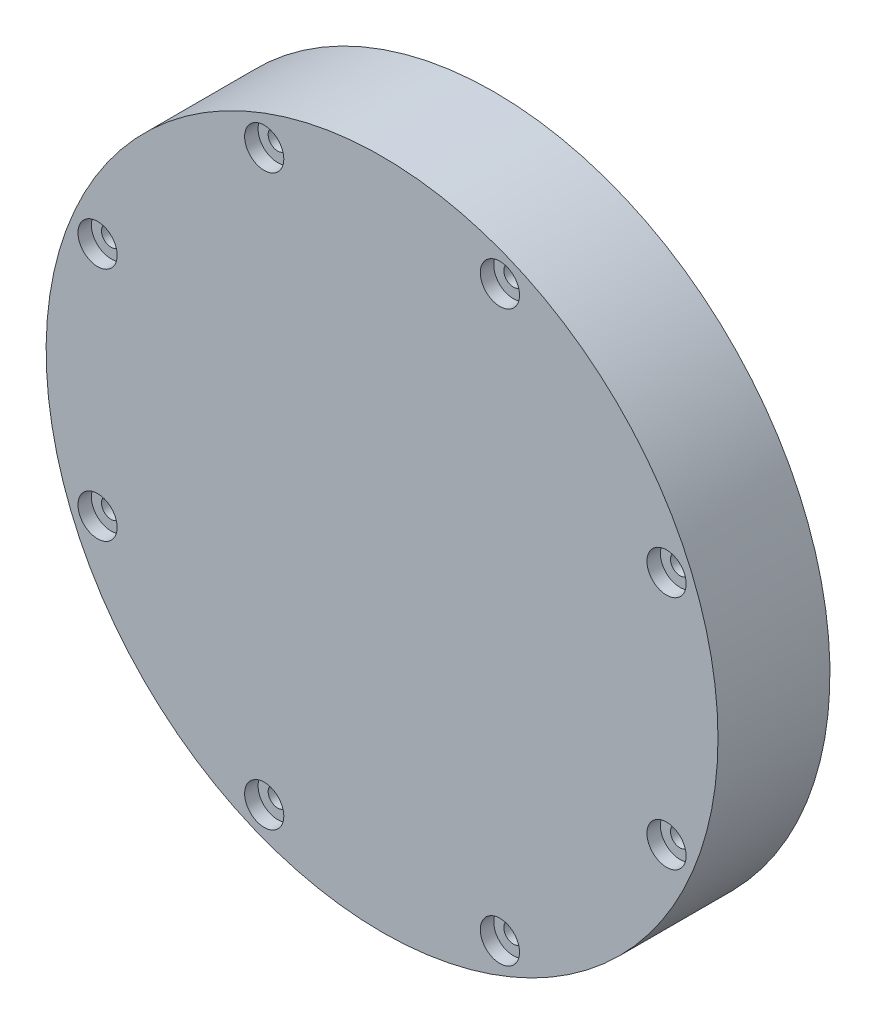
ISO-10303-21;
HEADER;
FILE_DESCRIPTION(('STEP AP214'),'2;1');
FILE_NAME('part.step','',(''),(''),'','','');
FILE_SCHEMA(('AUTOMOTIVE_DESIGN { 1 0 10303 214 1 1 1 1 }'));
ENDSEC;
DATA;
#1=APPLICATION_CONTEXT('core data for automotive mechanical design processes');
#2=APPLICATION_PROTOCOL_DEFINITION('international standard','automotive_design',2000,#1);
#3=PRODUCT_CONTEXT('',#1,'mechanical');
#4=PRODUCT('Part','Part','',(#3));
#5=PRODUCT_RELATED_PRODUCT_CATEGORY('part','',(#4));
#6=PRODUCT_DEFINITION_FORMATION('','',#4);
#7=PRODUCT_DEFINITION_CONTEXT('part definition',#1,'design');
#8=PRODUCT_DEFINITION('design','',#6,#7);
#9=PRODUCT_DEFINITION_SHAPE('','',#8);
#10=(LENGTH_UNIT() NAMED_UNIT(*) SI_UNIT(.MILLI.,.METRE.));
#11=(NAMED_UNIT(*) PLANE_ANGLE_UNIT() SI_UNIT($,.RADIAN.));
#12=(NAMED_UNIT(*) SI_UNIT($,.STERADIAN.) SOLID_ANGLE_UNIT());
#13=UNCERTAINTY_MEASURE_WITH_UNIT(LENGTH_MEASURE(1.E-05),#10,'distance_accuracy_value','');
#14=(GEOMETRIC_REPRESENTATION_CONTEXT(3) GLOBAL_UNCERTAINTY_ASSIGNED_CONTEXT((#13)) GLOBAL_UNIT_ASSIGNED_CONTEXT((#10,
#11,#12)) REPRESENTATION_CONTEXT('',''));
#15=CARTESIAN_POINT('',(0.,0.,0.));
#16=DIRECTION('',(0.,0.,1.));
#17=DIRECTION('',(1.,0.,0.));
#18=AXIS2_PLACEMENT_3D('',#15,#16,#17);
#19=CARTESIAN_POINT('',(18.,-54.0832691319598,15.));
#20=DIRECTION('',(0.,0.,-1.));
#21=DIRECTION('',(-1.,0.,0.));
#22=AXIS2_PLACEMENT_3D('',#19,#20,#21);
#23=CYLINDRICAL_SURFACE('',#22,3.);
#24=CARTESIAN_POINT('',(18.,-54.0832691319598,0.));
#25=DIRECTION('',(0.,0.,1.));
#26=DIRECTION('',(1.,0.,0.));
#27=AXIS2_PLACEMENT_3D('',#24,#25,#26);
#28=CIRCLE('',#27,3.);
#29=CARTESIAN_POINT('',(15.,-54.0832691319598,0.));
#30=VERTEX_POINT('',#29);
#31=CARTESIAN_POINT('',(18.9473684210526,-56.9297569810104,0.));
#32=VERTEX_POINT('',#31);
#33=EDGE_CURVE('E139',#30,#32,#28,.T.);
#34=ORIENTED_EDGE('',*,*,#33,.T.);
#35=DIRECTION('',(0.,0.,-1.));
#36=VECTOR('',#35,1.);
#37=CARTESIAN_POINT('',(18.9473684210526,-56.9297569810104,15.));
#38=LINE('',#37,#36);
#39=CARTESIAN_POINT('',(18.9473684210526,-56.9297569810104,15.));
#40=VERTEX_POINT('',#39);
#41=EDGE_CURVE('E11',#40,#32,#38,.T.);
#42=ORIENTED_EDGE('',*,*,#41,.F.);
#43=CARTESIAN_POINT('',(18.,-54.0832691319598,15.));
#44=DIRECTION('',(0.,0.,1.));
#45=DIRECTION('',(1.,0.,0.));
#46=AXIS2_PLACEMENT_3D('',#43,#44,#45);
#47=CIRCLE('',#46,3.);
#48=CARTESIAN_POINT('',(15.,-54.0832691319598,15.));
#49=VERTEX_POINT('',#48);
#50=EDGE_CURVE('E153',#49,#40,#47,.T.);
#51=ORIENTED_EDGE('',*,*,#50,.F.);
#52=DIRECTION('',(0.,0.,-1.));
#53=VECTOR('',#52,1.);
#54=CARTESIAN_POINT('',(15.,-54.0832691319598,15.));
#55=LINE('',#54,#53);
#56=EDGE_CURVE('E138',#49,#30,#55,.T.);
#57=ORIENTED_EDGE('',*,*,#56,.T.);
#58=EDGE_LOOP('',(#34,#42,#51,#57));
#59=FACE_BOUND('',#58,.T.);
#60=ADVANCED_FACE('F32',(#59),#23,.T.);
#61=CARTESIAN_POINT('',(0.,0.,15.));
#62=DIRECTION('',(0.,0.,-1.));
#63=DIRECTION('',(-1.,0.,0.));
#64=AXIS2_PLACEMENT_3D('',#61,#62,#63);
#65=CYLINDRICAL_SURFACE('',#64,60.);
#66=CARTESIAN_POINT('',(0.,0.,0.));
#67=DIRECTION('',(0.,0.,1.));
#68=DIRECTION('',(1.,0.,0.));
#69=AXIS2_PLACEMENT_3D('',#66,#67,#68);
#70=CIRCLE('',#69,60.);
#71=CARTESIAN_POINT('',(-18.9473684210526,-56.9297569810103,0.));
#72=VERTEX_POINT('',#71);
#73=EDGE_CURVE('E141',#32,#72,#70,.T.);
#74=ORIENTED_EDGE('',*,*,#73,.T.);
#75=DIRECTION('',(0.,0.,-1.));
#76=VECTOR('',#75,1.);
#77=CARTESIAN_POINT('',(-18.9473684210526,-56.9297569810103,15.));
#78=LINE('',#77,#76);
#79=CARTESIAN_POINT('',(-18.9473684210526,-56.9297569810103,15.));
#80=VERTEX_POINT('',#79);
#81=EDGE_CURVE('E40',#80,#72,#78,.T.);
#82=ORIENTED_EDGE('',*,*,#81,.F.);
#83=CARTESIAN_POINT('',(0.,0.,15.));
#84=DIRECTION('',(0.,0.,1.));
#85=DIRECTION('',(1.,0.,0.));
#86=AXIS2_PLACEMENT_3D('',#83,#84,#85);
#87=CIRCLE('',#86,60.);
#88=EDGE_CURVE('E174',#80,#40,#87,.T.);
#89=ORIENTED_EDGE('',*,*,#88,.T.);
#90=ORIENTED_EDGE('',*,*,#41,.T.);
#91=EDGE_LOOP('',(#74,#82,#89,#90));
#92=FACE_BOUND('',#91,.T.);
#93=CARTESIAN_POINT('',(0.,0.,20.));
#94=DIRECTION('',(0.,0.,1.));
#95=DIRECTION('',(1.,0.,0.));
#96=AXIS2_PLACEMENT_3D('',#93,#94,#95);
#97=CIRCLE('',#96,60.);
#98=CARTESIAN_POINT('',(60.,0.,20.));
#99=VERTEX_POINT('',#98);
#100=EDGE_CURVE('E142',#99,#99,#97,.T.);
#101=ORIENTED_EDGE('',*,*,#100,.F.);
#102=EDGE_LOOP('',(#101));
#103=FACE_BOUND('',#102,.T.);
#104=ADVANCED_FACE('F300',(#92,#103),#65,.T.);
#105=CARTESIAN_POINT('',(-18.,-54.0832691319598,15.));
#106=DIRECTION('',(0.,0.,-1.));
#107=DIRECTION('',(-1.,0.,0.));
#108=AXIS2_PLACEMENT_3D('',#105,#106,#107);
#109=CYLINDRICAL_SURFACE('',#108,3.);
#110=CARTESIAN_POINT('',(-18.,-54.0832691319598,0.));
#111=DIRECTION('',(0.,0.,1.));
#112=DIRECTION('',(-1.,0.,0.));
#113=AXIS2_PLACEMENT_3D('',#110,#111,#112);
#114=CIRCLE('',#113,3.);
#115=CARTESIAN_POINT('',(-15.,-54.0832691319598,0.));
#116=VERTEX_POINT('',#115);
#117=EDGE_CURVE('E144',#72,#116,#114,.T.);
#118=ORIENTED_EDGE('',*,*,#117,.T.);
#119=DIRECTION('',(0.,0.,-1.));
#120=VECTOR('',#119,1.);
#121=CARTESIAN_POINT('',(-15.,-54.0832691319598,15.));
#122=LINE('',#121,#120);
#123=CARTESIAN_POINT('',(-15.,-54.0832691319598,15.));
#124=VERTEX_POINT('',#123);
#125=EDGE_CURVE('E158',#124,#116,#122,.T.);
#126=ORIENTED_EDGE('',*,*,#125,.F.);
#127=CARTESIAN_POINT('',(-18.,-54.0832691319598,15.));
#128=DIRECTION('',(0.,0.,1.));
#129=DIRECTION('',(-1.,0.,0.));
#130=AXIS2_PLACEMENT_3D('',#127,#128,#129);
#131=CIRCLE('',#130,3.);
#132=EDGE_CURVE('E131',#80,#124,#131,.T.);
#133=ORIENTED_EDGE('',*,*,#132,.F.);
#134=ORIENTED_EDGE('',*,*,#81,.T.);
#135=EDGE_LOOP('',(#118,#126,#133,#134));
#136=FACE_BOUND('',#135,.T.);
#137=ADVANCED_FACE('F164',(#136),#109,.T.);
#138=CARTESIAN_POINT('',(-15.,-49.8497743224581,15.));
#139=DIRECTION('',(-1.,0.,0.));
#140=DIRECTION('',(0.,0.,1.));
#141=AXIS2_PLACEMENT_3D('',#138,#139,#140);
#142=PLANE('',#141);
#143=DIRECTION('',(0.,1.,0.));
#144=VECTOR('',#143,1.);
#145=CARTESIAN_POINT('',(-15.,-49.8497743224581,0.));
#146=LINE('',#145,#144);
#147=CARTESIAN_POINT('',(-15.,-49.8497743224581,0.));
#148=VERTEX_POINT('',#147);
#149=EDGE_CURVE('E146',#116,#148,#146,.T.);
#150=ORIENTED_EDGE('',*,*,#149,.T.);
#151=DIRECTION('',(0.,0.,-1.));
#152=VECTOR('',#151,1.);
#153=CARTESIAN_POINT('',(-15.,-49.8497743224581,15.));
#154=LINE('',#153,#152);
#155=CARTESIAN_POINT('',(-15.,-49.8497743224581,15.));
#156=VERTEX_POINT('',#155);
#157=EDGE_CURVE('E115',#156,#148,#154,.T.);
#158=ORIENTED_EDGE('',*,*,#157,.F.);
#159=DIRECTION('',(0.,1.,0.));
#160=VECTOR('',#159,1.);
#161=CARTESIAN_POINT('',(-15.,-49.8497743224581,15.));
#162=LINE('',#161,#160);
#163=EDGE_CURVE('E129',#124,#156,#162,.T.);
#164=ORIENTED_EDGE('',*,*,#163,.F.);
#165=ORIENTED_EDGE('',*,*,#125,.T.);
#166=EDGE_LOOP('',(#150,#158,#164,#165));
#167=FACE_BOUND('',#166,.T.);
#168=ADVANCED_FACE('F173',(#167),#142,.F.);
#169=CARTESIAN_POINT('',(-18.,-49.8497743224581,15.));
#170=DIRECTION('',(0.,0.,-1.));
#171=DIRECTION('',(-1.,0.,0.));
#172=AXIS2_PLACEMENT_3D('',#169,#170,#171);
#173=CYLINDRICAL_SURFACE('',#172,3.);
#174=CARTESIAN_POINT('',(-18.,-49.8497743224581,0.));
#175=DIRECTION('',(0.,0.,1.));
#176=DIRECTION('',(1.,0.,0.));
#177=AXIS2_PLACEMENT_3D('',#174,#175,#176);
#178=CIRCLE('',#177,3.);
#179=CARTESIAN_POINT('',(-16.9811320754718,-47.028088983451,0.));
#180=VERTEX_POINT('',#179);
#181=EDGE_CURVE('E112',#148,#180,#178,.T.);
#182=ORIENTED_EDGE('',*,*,#181,.T.);
#183=DIRECTION('',(0.,0.,-1.));
#184=VECTOR('',#183,1.);
#185=CARTESIAN_POINT('',(-16.9811320754718,-47.028088983451,15.));
#186=LINE('',#185,#184);
#187=CARTESIAN_POINT('',(-16.9811320754718,-47.028088983451,15.));
#188=VERTEX_POINT('',#187);
#189=EDGE_CURVE('E104',#188,#180,#186,.T.);
#190=ORIENTED_EDGE('',*,*,#189,.F.);
#191=CARTESIAN_POINT('',(-18.,-49.8497743224581,15.));
#192=DIRECTION('',(0.,0.,1.));
#193=DIRECTION('',(1.,0.,0.));
#194=AXIS2_PLACEMENT_3D('',#191,#192,#193);
#195=CIRCLE('',#194,3.);
#196=EDGE_CURVE('E109',#156,#188,#195,.T.);
#197=ORIENTED_EDGE('',*,*,#196,.F.);
#198=ORIENTED_EDGE('',*,*,#157,.T.);
#199=EDGE_LOOP('',(#182,#190,#197,#198));
#200=FACE_BOUND('',#199,.T.);
#201=ADVANCED_FACE('F106',(#200),#173,.T.);
#202=CARTESIAN_POINT('',(0.,0.,15.));
#203=DIRECTION('',(0.,0.,-1.));
#204=DIRECTION('',(-1.,0.,0.));
#205=AXIS2_PLACEMENT_3D('',#202,#203,#204);
#206=CYLINDRICAL_SURFACE('',#205,50.);
#207=CARTESIAN_POINT('',(0.,0.,0.));
#208=DIRECTION('',(0.,0.,-1.));
#209=DIRECTION('',(1.,0.,0.));
#210=AXIS2_PLACEMENT_3D('',#207,#208,#209);
#211=CIRCLE('',#210,50.);
#212=CARTESIAN_POINT('',(16.9811320754717,-47.028088983451,0.));
#213=VERTEX_POINT('',#212);
#214=EDGE_CURVE('E149',#180,#213,#211,.T.);
#215=ORIENTED_EDGE('',*,*,#214,.T.);
#216=DIRECTION('',(0.,0.,-1.));
#217=VECTOR('',#216,1.);
#218=CARTESIAN_POINT('',(16.9811320754717,-47.028088983451,15.));
#219=LINE('',#218,#217);
#220=CARTESIAN_POINT('',(16.9811320754717,-47.028088983451,15.));
#221=VERTEX_POINT('',#220);
#222=EDGE_CURVE('E116',#221,#213,#219,.T.);
#223=ORIENTED_EDGE('',*,*,#222,.F.);
#224=CARTESIAN_POINT('',(0.,0.,15.));
#225=DIRECTION('',(0.,0.,-1.));
#226=DIRECTION('',(1.,0.,0.));
#227=AXIS2_PLACEMENT_3D('',#224,#225,#226);
#228=CIRCLE('',#227,50.);
#229=EDGE_CURVE('E119',#188,#221,#228,.T.);
#230=ORIENTED_EDGE('',*,*,#229,.F.);
#231=ORIENTED_EDGE('',*,*,#189,.T.);
#232=EDGE_LOOP('',(#215,#223,#230,#231));
#233=FACE_BOUND('',#232,.T.);
#234=ADVANCED_FACE('F120',(#233),#206,.F.);
#235=CARTESIAN_POINT('',(18.,-49.8497743224581,15.));
#236=DIRECTION('',(0.,0.,-1.));
#237=DIRECTION('',(-1.,0.,0.));
#238=AXIS2_PLACEMENT_3D('',#235,#236,#237);
#239=CYLINDRICAL_SURFACE('',#238,3.);
#240=CARTESIAN_POINT('',(18.,-49.8497743224581,0.));
#241=DIRECTION('',(0.,0.,1.));
#242=DIRECTION('',(-1.,0.,0.));
#243=AXIS2_PLACEMENT_3D('',#240,#241,#242);
#244=CIRCLE('',#243,3.);
#245=CARTESIAN_POINT('',(15.,-49.8497743224581,0.));
#246=VERTEX_POINT('',#245);
#247=EDGE_CURVE('E76',#213,#246,#244,.T.);
#248=ORIENTED_EDGE('',*,*,#247,.T.);
#249=DIRECTION('',(0.,0.,-1.));
#250=VECTOR('',#249,1.);
#251=CARTESIAN_POINT('',(15.,-49.8497743224581,15.));
#252=LINE('',#251,#250);
#253=CARTESIAN_POINT('',(15.,-49.8497743224581,15.));
#254=VERTEX_POINT('',#253);
#255=EDGE_CURVE('E48',#254,#246,#252,.T.);
#256=ORIENTED_EDGE('',*,*,#255,.F.);
#257=CARTESIAN_POINT('',(18.,-49.8497743224581,15.));
#258=DIRECTION('',(0.,0.,1.));
#259=DIRECTION('',(-1.,0.,0.));
#260=AXIS2_PLACEMENT_3D('',#257,#258,#259);
#261=CIRCLE('',#260,3.);
#262=EDGE_CURVE('E123',#221,#254,#261,.T.);
#263=ORIENTED_EDGE('',*,*,#262,.F.);
#264=ORIENTED_EDGE('',*,*,#222,.T.);
#265=EDGE_LOOP('',(#248,#256,#263,#264));
#266=FACE_BOUND('',#265,.T.);
#267=ADVANCED_FACE('F314',(#266),#239,.T.);
#268=CARTESIAN_POINT('',(15.,-49.8497743224581,15.));
#269=DIRECTION('',(1.,0.,0.));
#270=DIRECTION('',(0.,0.,-1.));
#271=AXIS2_PLACEMENT_3D('',#268,#269,#270);
#272=PLANE('',#271);
#273=DIRECTION('',(0.,-1.,0.));
#274=VECTOR('',#273,1.);
#275=CARTESIAN_POINT('',(15.,-49.8497743224581,0.));
#276=LINE('',#275,#274);
#277=EDGE_CURVE('E82',#246,#30,#276,.T.);
#278=ORIENTED_EDGE('',*,*,#277,.T.);
#279=ORIENTED_EDGE('',*,*,#56,.F.);
#280=DIRECTION('',(0.,-1.,0.));
#281=VECTOR('',#280,1.);
#282=CARTESIAN_POINT('',(15.,-49.8497743224581,15.));
#283=LINE('',#282,#281);
#284=EDGE_CURVE('E136',#254,#49,#283,.T.);
#285=ORIENTED_EDGE('',*,*,#284,.F.);
#286=ORIENTED_EDGE('',*,*,#255,.T.);
#287=EDGE_LOOP('',(#278,#279,#285,#286));
#288=FACE_BOUND('',#287,.T.);
#289=ADVANCED_FACE('F317',(#288),#272,.F.);
#290=CARTESIAN_POINT('',(18.,-54.0832691319598,0.));
#291=DIRECTION('',(0.,0.,1.));
#292=DIRECTION('',(1.,0.,0.));
#293=AXIS2_PLACEMENT_3D('',#290,#291,#292);
#294=PLANE('',#293);
#295=CARTESIAN_POINT('',(21.04758878008,50.8133742881208,0.));
#296=DIRECTION('',(0.,0.,1.));
#297=DIRECTION('',(1.,0.,0.));
#298=AXIS2_PLACEMENT_3D('',#295,#296,#297);
#299=CIRCLE('',#298,1.7);
#300=CARTESIAN_POINT('',(22.74758878008,50.8133742881208,0.));
#301=VERTEX_POINT('',#300);
#302=EDGE_CURVE('E264',#301,#301,#299,.T.);
#303=ORIENTED_EDGE('',*,*,#302,.T.);
#304=EDGE_LOOP('',(#303));
#305=FACE_BOUND('',#304,.T.);
#306=CARTESIAN_POINT('',(50.8133742881208,21.0475887800799,0.));
#307=DIRECTION('',(0.,0.,1.));
#308=DIRECTION('',(1.,0.,0.));
#309=AXIS2_PLACEMENT_3D('',#306,#307,#308);
#310=CIRCLE('',#309,1.7);
#311=CARTESIAN_POINT('',(52.5133742881208,21.0475887800799,0.));
#312=VERTEX_POINT('',#311);
#313=EDGE_CURVE('E252',#312,#312,#310,.T.);
#314=ORIENTED_EDGE('',*,*,#313,.T.);
#315=EDGE_LOOP('',(#314));
#316=FACE_BOUND('',#315,.T.);
#317=CARTESIAN_POINT('',(50.8133742881208,-21.04758878008,0.));
#318=DIRECTION('',(0.,0.,1.));
#319=DIRECTION('',(1.,0.,0.));
#320=AXIS2_PLACEMENT_3D('',#317,#318,#319);
#321=CIRCLE('',#320,1.7);
#322=CARTESIAN_POINT('',(52.5133742881208,-21.04758878008,0.));
#323=VERTEX_POINT('',#322);
#324=EDGE_CURVE('E240',#323,#323,#321,.T.);
#325=ORIENTED_EDGE('',*,*,#324,.T.);
#326=EDGE_LOOP('',(#325));
#327=FACE_BOUND('',#326,.T.);
#328=CARTESIAN_POINT('',(21.0475887800799,-50.8133742881208,0.));
#329=DIRECTION('',(0.,0.,1.));
#330=DIRECTION('',(1.,0.,0.));
#331=AXIS2_PLACEMENT_3D('',#328,#329,#330);
#332=CIRCLE('',#331,1.7);
#333=CARTESIAN_POINT('',(22.7475887800799,-50.8133742881208,0.));
#334=VERTEX_POINT('',#333);
#335=EDGE_CURVE('E228',#334,#334,#332,.T.);
#336=ORIENTED_EDGE('',*,*,#335,.T.);
#337=EDGE_LOOP('',(#336));
#338=FACE_BOUND('',#337,.T.);
#339=CARTESIAN_POINT('',(-21.04758878008,-50.8133742881208,0.));
#340=DIRECTION('',(0.,0.,1.));
#341=DIRECTION('',(1.,0.,0.));
#342=AXIS2_PLACEMENT_3D('',#339,#340,#341);
#343=CIRCLE('',#342,1.7);
#344=CARTESIAN_POINT('',(-19.34758878008,-50.8133742881208,0.));
#345=VERTEX_POINT('',#344);
#346=EDGE_CURVE('E216',#345,#345,#343,.T.);
#347=ORIENTED_EDGE('',*,*,#346,.T.);
#348=EDGE_LOOP('',(#347));
#349=FACE_BOUND('',#348,.T.);
#350=CARTESIAN_POINT('',(-50.8133742881208,-21.0475887800799,0.));
#351=DIRECTION('',(0.,0.,1.));
#352=DIRECTION('',(1.,0.,0.));
#353=AXIS2_PLACEMENT_3D('',#350,#351,#352);
#354=CIRCLE('',#353,1.7);
#355=CARTESIAN_POINT('',(-49.1133742881208,-21.0475887800799,0.));
#356=VERTEX_POINT('',#355);
#357=EDGE_CURVE('E204',#356,#356,#354,.T.);
#358=ORIENTED_EDGE('',*,*,#357,.T.);
#359=EDGE_LOOP('',(#358));
#360=FACE_BOUND('',#359,.T.);
#361=CARTESIAN_POINT('',(-50.8133742881208,21.04758878008,0.));
#362=DIRECTION('',(0.,0.,1.));
#363=DIRECTION('',(1.,0.,0.));
#364=AXIS2_PLACEMENT_3D('',#361,#362,#363);
#365=CIRCLE('',#364,1.7);
#366=CARTESIAN_POINT('',(-49.1133742881208,21.04758878008,0.));
#367=VERTEX_POINT('',#366);
#368=EDGE_CURVE('E192',#367,#367,#365,.T.);
#369=ORIENTED_EDGE('',*,*,#368,.T.);
#370=EDGE_LOOP('',(#369));
#371=FACE_BOUND('',#370,.T.);
#372=CARTESIAN_POINT('',(-21.0475887800799,50.8133742881208,0.));
#373=DIRECTION('',(0.,0.,1.));
#374=DIRECTION('',(1.,0.,0.));
#375=AXIS2_PLACEMENT_3D('',#372,#373,#374);
#376=CIRCLE('',#375,1.7);
#377=CARTESIAN_POINT('',(-19.3475887800799,50.8133742881208,0.));
#378=VERTEX_POINT('',#377);
#379=EDGE_CURVE('E178',#378,#378,#376,.T.);
#380=ORIENTED_EDGE('',*,*,#379,.T.);
#381=EDGE_LOOP('',(#380));
#382=FACE_BOUND('',#381,.T.);
#383=ORIENTED_EDGE('',*,*,#33,.F.);
#384=ORIENTED_EDGE('',*,*,#277,.F.);
#385=ORIENTED_EDGE('',*,*,#247,.F.);
#386=ORIENTED_EDGE('',*,*,#214,.F.);
#387=ORIENTED_EDGE('',*,*,#181,.F.);
#388=ORIENTED_EDGE('',*,*,#149,.F.);
#389=ORIENTED_EDGE('',*,*,#117,.F.);
#390=ORIENTED_EDGE('',*,*,#73,.F.);
#391=EDGE_LOOP('',(#383,#384,#385,#386,#387,#388,#389,#390));
#392=FACE_BOUND('',#391,.T.);
#393=ADVANCED_FACE('F171',(#305,#316,#327,#338,#349,#360,#371,#382,#392),#294,.F.);
#394=CARTESIAN_POINT('',(0.,0.,15.));
#395=DIRECTION('',(0.,0.,1.));
#396=DIRECTION('',(1.,0.,0.));
#397=AXIS2_PLACEMENT_3D('',#394,#395,#396);
#398=PLANE('',#397);
#399=ORIENTED_EDGE('',*,*,#284,.T.);
#400=ORIENTED_EDGE('',*,*,#50,.T.);
#401=ORIENTED_EDGE('',*,*,#88,.F.);
#402=ORIENTED_EDGE('',*,*,#132,.T.);
#403=ORIENTED_EDGE('',*,*,#163,.T.);
#404=ORIENTED_EDGE('',*,*,#196,.T.);
#405=ORIENTED_EDGE('',*,*,#229,.T.);
#406=ORIENTED_EDGE('',*,*,#262,.T.);
#407=EDGE_LOOP('',(#399,#400,#401,#402,#403,#404,#405,#406));
#408=FACE_BOUND('',#407,.T.);
#409=ADVANCED_FACE('F126',(#408),#398,.F.);
#410=CARTESIAN_POINT('',(0.,0.,20.));
#411=DIRECTION('',(0.,0.,1.));
#412=DIRECTION('',(1.,0.,0.));
#413=AXIS2_PLACEMENT_3D('',#410,#411,#412);
#414=PLANE('',#413);
#415=CARTESIAN_POINT('',(21.04758878008,50.8133742881208,20.));
#416=DIRECTION('',(0.,0.,1.));
#417=DIRECTION('',(1.,0.,0.));
#418=AXIS2_PLACEMENT_3D('',#415,#416,#417);
#419=CIRCLE('',#418,3.5);
#420=CARTESIAN_POINT('',(24.54758878008,50.8133742881208,20.));
#421=VERTEX_POINT('',#420);
#422=EDGE_CURVE('E273',#421,#421,#419,.T.);
#423=ORIENTED_EDGE('',*,*,#422,.F.);
#424=EDGE_LOOP('',(#423));
#425=FACE_BOUND('',#424,.T.);
#426=CARTESIAN_POINT('',(50.8133742881208,21.0475887800799,20.));
#427=DIRECTION('',(0.,0.,1.));
#428=DIRECTION('',(1.,0.,0.));
#429=AXIS2_PLACEMENT_3D('',#426,#427,#428);
#430=CIRCLE('',#429,3.5);
#431=CARTESIAN_POINT('',(54.3133742881208,21.0475887800799,20.));
#432=VERTEX_POINT('',#431);
#433=EDGE_CURVE('E261',#432,#432,#430,.T.);
#434=ORIENTED_EDGE('',*,*,#433,.F.);
#435=EDGE_LOOP('',(#434));
#436=FACE_BOUND('',#435,.T.);
#437=CARTESIAN_POINT('',(50.8133742881208,-21.04758878008,20.));
#438=DIRECTION('',(0.,0.,1.));
#439=DIRECTION('',(1.,0.,0.));
#440=AXIS2_PLACEMENT_3D('',#437,#438,#439);
#441=CIRCLE('',#440,3.5);
#442=CARTESIAN_POINT('',(54.3133742881208,-21.04758878008,20.));
#443=VERTEX_POINT('',#442);
#444=EDGE_CURVE('E249',#443,#443,#441,.T.);
#445=ORIENTED_EDGE('',*,*,#444,.F.);
#446=EDGE_LOOP('',(#445));
#447=FACE_BOUND('',#446,.T.);
#448=CARTESIAN_POINT('',(21.0475887800799,-50.8133742881208,20.));
#449=DIRECTION('',(0.,0.,1.));
#450=DIRECTION('',(1.,0.,0.));
#451=AXIS2_PLACEMENT_3D('',#448,#449,#450);
#452=CIRCLE('',#451,3.5);
#453=CARTESIAN_POINT('',(24.5475887800799,-50.8133742881208,20.));
#454=VERTEX_POINT('',#453);
#455=EDGE_CURVE('E237',#454,#454,#452,.T.);
#456=ORIENTED_EDGE('',*,*,#455,.F.);
#457=EDGE_LOOP('',(#456));
#458=FACE_BOUND('',#457,.T.);
#459=CARTESIAN_POINT('',(-21.04758878008,-50.8133742881208,20.));
#460=DIRECTION('',(0.,0.,1.));
#461=DIRECTION('',(1.,0.,0.));
#462=AXIS2_PLACEMENT_3D('',#459,#460,#461);
#463=CIRCLE('',#462,3.5);
#464=CARTESIAN_POINT('',(-17.54758878008,-50.8133742881208,20.));
#465=VERTEX_POINT('',#464);
#466=EDGE_CURVE('E225',#465,#465,#463,.T.);
#467=ORIENTED_EDGE('',*,*,#466,.F.);
#468=EDGE_LOOP('',(#467));
#469=FACE_BOUND('',#468,.T.);
#470=CARTESIAN_POINT('',(-50.8133742881208,-21.0475887800799,20.));
#471=DIRECTION('',(0.,0.,1.));
#472=DIRECTION('',(1.,0.,0.));
#473=AXIS2_PLACEMENT_3D('',#470,#471,#472);
#474=CIRCLE('',#473,3.5);
#475=CARTESIAN_POINT('',(-47.3133742881208,-21.0475887800799,20.));
#476=VERTEX_POINT('',#475);
#477=EDGE_CURVE('E213',#476,#476,#474,.T.);
#478=ORIENTED_EDGE('',*,*,#477,.F.);
#479=EDGE_LOOP('',(#478));
#480=FACE_BOUND('',#479,.T.);
#481=CARTESIAN_POINT('',(-50.8133742881208,21.04758878008,20.));
#482=DIRECTION('',(0.,0.,1.));
#483=DIRECTION('',(1.,0.,0.));
#484=AXIS2_PLACEMENT_3D('',#481,#482,#483);
#485=CIRCLE('',#484,3.5);
#486=CARTESIAN_POINT('',(-47.3133742881208,21.04758878008,20.));
#487=VERTEX_POINT('',#486);
#488=EDGE_CURVE('E201',#487,#487,#485,.T.);
#489=ORIENTED_EDGE('',*,*,#488,.F.);
#490=EDGE_LOOP('',(#489));
#491=FACE_BOUND('',#490,.T.);
#492=CARTESIAN_POINT('',(-21.0475887800799,50.8133742881208,20.));
#493=DIRECTION('',(0.,0.,1.));
#494=DIRECTION('',(1.,0.,0.));
#495=AXIS2_PLACEMENT_3D('',#492,#493,#494);
#496=CIRCLE('',#495,3.5);
#497=CARTESIAN_POINT('',(-17.5475887800799,50.8133742881208,20.));
#498=VERTEX_POINT('',#497);
#499=EDGE_CURVE('E189',#498,#498,#496,.T.);
#500=ORIENTED_EDGE('',*,*,#499,.F.);
#501=EDGE_LOOP('',(#500));
#502=FACE_BOUND('',#501,.T.);
#503=ORIENTED_EDGE('',*,*,#100,.T.);
#504=EDGE_LOOP('',(#503));
#505=FACE_BOUND('',#504,.T.);
#506=ADVANCED_FACE('F279',(#425,#436,#447,#458,#469,#480,#491,#502,#505),#414,.T.);
#507=CARTESIAN_POINT('',(-21.0475887800799,50.8133742881208,20.));
#508=DIRECTION('',(0.,0.,1.));
#509=DIRECTION('',(1.,0.,0.));
#510=AXIS2_PLACEMENT_3D('',#507,#508,#509);
#511=CYLINDRICAL_SURFACE('',#510,1.7);
#512=ORIENTED_EDGE('',*,*,#379,.F.);
#513=EDGE_LOOP('',(#512));
#514=FACE_BOUND('',#513,.T.);
#515=CARTESIAN_POINT('',(-21.0475887800799,50.8133742881208,17.6));
#516=DIRECTION('',(0.,0.,1.));
#517=DIRECTION('',(1.,0.,0.));
#518=AXIS2_PLACEMENT_3D('',#515,#516,#517);
#519=CIRCLE('',#518,1.7);
#520=CARTESIAN_POINT('',(-19.3475887800799,50.8133742881208,17.6));
#521=VERTEX_POINT('',#520);
#522=EDGE_CURVE('E183',#521,#521,#519,.T.);
#523=ORIENTED_EDGE('',*,*,#522,.T.);
#524=EDGE_LOOP('',(#523));
#525=FACE_BOUND('',#524,.T.);
#526=ADVANCED_FACE('F282',(#514,#525),#511,.F.);
#527=CARTESIAN_POINT('',(-19.3475887800799,50.8133742881208,17.6));
#528=DIRECTION('',(0.,0.,-1.));
#529=DIRECTION('',(-1.,0.,0.));
#530=AXIS2_PLACEMENT_3D('',#527,#528,#529);
#531=PLANE('',#530);
#532=ORIENTED_EDGE('',*,*,#522,.F.);
#533=EDGE_LOOP('',(#532));
#534=FACE_BOUND('',#533,.T.);
#535=CARTESIAN_POINT('',(-21.0475887800799,50.8133742881208,17.6));
#536=DIRECTION('',(0.,0.,1.));
#537=DIRECTION('',(1.,0.,0.));
#538=AXIS2_PLACEMENT_3D('',#535,#536,#537);
#539=CIRCLE('',#538,3.5);
#540=CARTESIAN_POINT('',(-17.5475887800799,50.8133742881208,17.6));
#541=VERTEX_POINT('',#540);
#542=EDGE_CURVE('E186',#541,#541,#539,.T.);
#543=ORIENTED_EDGE('',*,*,#542,.T.);
#544=EDGE_LOOP('',(#543));
#545=FACE_BOUND('',#544,.T.);
#546=ADVANCED_FACE('F327',(#534,#545),#531,.F.);
#547=CARTESIAN_POINT('',(-21.0475887800799,50.8133742881208,20.));
#548=DIRECTION('',(0.,0.,1.));
#549=DIRECTION('',(1.,0.,0.));
#550=AXIS2_PLACEMENT_3D('',#547,#548,#549);
#551=CYLINDRICAL_SURFACE('',#550,3.5);
#552=ORIENTED_EDGE('',*,*,#542,.F.);
#553=EDGE_LOOP('',(#552));
#554=FACE_BOUND('',#553,.T.);
#555=ORIENTED_EDGE('',*,*,#499,.T.);
#556=EDGE_LOOP('',(#555));
#557=FACE_BOUND('',#556,.T.);
#558=ADVANCED_FACE('F331',(#554,#557),#551,.F.);
#559=CARTESIAN_POINT('',(-50.8133742881208,21.04758878008,20.));
#560=DIRECTION('',(0.,0.,1.));
#561=DIRECTION('',(1.,0.,0.));
#562=AXIS2_PLACEMENT_3D('',#559,#560,#561);
#563=CYLINDRICAL_SURFACE('',#562,1.7);
#564=ORIENTED_EDGE('',*,*,#368,.F.);
#565=EDGE_LOOP('',(#564));
#566=FACE_BOUND('',#565,.T.);
#567=CARTESIAN_POINT('',(-50.8133742881208,21.04758878008,17.6));
#568=DIRECTION('',(0.,0.,1.));
#569=DIRECTION('',(1.,0.,0.));
#570=AXIS2_PLACEMENT_3D('',#567,#568,#569);
#571=CIRCLE('',#570,1.7);
#572=CARTESIAN_POINT('',(-49.1133742881208,21.04758878008,17.6));
#573=VERTEX_POINT('',#572);
#574=EDGE_CURVE('E195',#573,#573,#571,.T.);
#575=ORIENTED_EDGE('',*,*,#574,.T.);
#576=EDGE_LOOP('',(#575));
#577=FACE_BOUND('',#576,.T.);
#578=ADVANCED_FACE('F335',(#566,#577),#563,.F.);
#579=CARTESIAN_POINT('',(-49.1133742881208,21.04758878008,17.6));
#580=DIRECTION('',(0.,0.,-1.));
#581=DIRECTION('',(-1.,0.,0.));
#582=AXIS2_PLACEMENT_3D('',#579,#580,#581);
#583=PLANE('',#582);
#584=ORIENTED_EDGE('',*,*,#574,.F.);
#585=EDGE_LOOP('',(#584));
#586=FACE_BOUND('',#585,.T.);
#587=CARTESIAN_POINT('',(-50.8133742881208,21.04758878008,17.6));
#588=DIRECTION('',(0.,0.,1.));
#589=DIRECTION('',(1.,0.,0.));
#590=AXIS2_PLACEMENT_3D('',#587,#588,#589);
#591=CIRCLE('',#590,3.5);
#592=CARTESIAN_POINT('',(-47.3133742881208,21.04758878008,17.6));
#593=VERTEX_POINT('',#592);
#594=EDGE_CURVE('E198',#593,#593,#591,.T.);
#595=ORIENTED_EDGE('',*,*,#594,.T.);
#596=EDGE_LOOP('',(#595));
#597=FACE_BOUND('',#596,.T.);
#598=ADVANCED_FACE('F339',(#586,#597),#583,.F.);
#599=CARTESIAN_POINT('',(-50.8133742881208,21.04758878008,20.));
#600=DIRECTION('',(0.,0.,1.));
#601=DIRECTION('',(1.,0.,0.));
#602=AXIS2_PLACEMENT_3D('',#599,#600,#601);
#603=CYLINDRICAL_SURFACE('',#602,3.5);
#604=ORIENTED_EDGE('',*,*,#594,.F.);
#605=EDGE_LOOP('',(#604));
#606=FACE_BOUND('',#605,.T.);
#607=ORIENTED_EDGE('',*,*,#488,.T.);
#608=EDGE_LOOP('',(#607));
#609=FACE_BOUND('',#608,.T.);
#610=ADVANCED_FACE('F343',(#606,#609),#603,.F.);
#611=CARTESIAN_POINT('',(-50.8133742881208,-21.0475887800799,20.));
#612=DIRECTION('',(0.,0.,1.));
#613=DIRECTION('',(1.,0.,0.));
#614=AXIS2_PLACEMENT_3D('',#611,#612,#613);
#615=CYLINDRICAL_SURFACE('',#614,1.7);
#616=ORIENTED_EDGE('',*,*,#357,.F.);
#617=EDGE_LOOP('',(#616));
#618=FACE_BOUND('',#617,.T.);
#619=CARTESIAN_POINT('',(-50.8133742881208,-21.0475887800799,17.6));
#620=DIRECTION('',(0.,0.,1.));
#621=DIRECTION('',(1.,0.,0.));
#622=AXIS2_PLACEMENT_3D('',#619,#620,#621);
#623=CIRCLE('',#622,1.7);
#624=CARTESIAN_POINT('',(-49.1133742881208,-21.0475887800799,17.6));
#625=VERTEX_POINT('',#624);
#626=EDGE_CURVE('E207',#625,#625,#623,.T.);
#627=ORIENTED_EDGE('',*,*,#626,.T.);
#628=EDGE_LOOP('',(#627));
#629=FACE_BOUND('',#628,.T.);
#630=ADVANCED_FACE('F347',(#618,#629),#615,.F.);
#631=CARTESIAN_POINT('',(-49.1133742881208,-21.0475887800799,17.6));
#632=DIRECTION('',(0.,0.,-1.));
#633=DIRECTION('',(-1.,0.,0.));
#634=AXIS2_PLACEMENT_3D('',#631,#632,#633);
#635=PLANE('',#634);
#636=ORIENTED_EDGE('',*,*,#626,.F.);
#637=EDGE_LOOP('',(#636));
#638=FACE_BOUND('',#637,.T.);
#639=CARTESIAN_POINT('',(-50.8133742881208,-21.0475887800799,17.6));
#640=DIRECTION('',(0.,0.,1.));
#641=DIRECTION('',(1.,0.,0.));
#642=AXIS2_PLACEMENT_3D('',#639,#640,#641);
#643=CIRCLE('',#642,3.5);
#644=CARTESIAN_POINT('',(-47.3133742881208,-21.0475887800799,17.6));
#645=VERTEX_POINT('',#644);
#646=EDGE_CURVE('E210',#645,#645,#643,.T.);
#647=ORIENTED_EDGE('',*,*,#646,.T.);
#648=EDGE_LOOP('',(#647));
#649=FACE_BOUND('',#648,.T.);
#650=ADVANCED_FACE('F351',(#638,#649),#635,.F.);
#651=CARTESIAN_POINT('',(-50.8133742881208,-21.0475887800799,20.));
#652=DIRECTION('',(0.,0.,1.));
#653=DIRECTION('',(1.,0.,0.));
#654=AXIS2_PLACEMENT_3D('',#651,#652,#653);
#655=CYLINDRICAL_SURFACE('',#654,3.5);
#656=ORIENTED_EDGE('',*,*,#646,.F.);
#657=EDGE_LOOP('',(#656));
#658=FACE_BOUND('',#657,.T.);
#659=ORIENTED_EDGE('',*,*,#477,.T.);
#660=EDGE_LOOP('',(#659));
#661=FACE_BOUND('',#660,.T.);
#662=ADVANCED_FACE('F355',(#658,#661),#655,.F.);
#663=CARTESIAN_POINT('',(-21.04758878008,-50.8133742881208,20.));
#664=DIRECTION('',(0.,0.,1.));
#665=DIRECTION('',(1.,0.,0.));
#666=AXIS2_PLACEMENT_3D('',#663,#664,#665);
#667=CYLINDRICAL_SURFACE('',#666,1.7);
#668=ORIENTED_EDGE('',*,*,#346,.F.);
#669=EDGE_LOOP('',(#668));
#670=FACE_BOUND('',#669,.T.);
#671=CARTESIAN_POINT('',(-21.04758878008,-50.8133742881208,17.6));
#672=DIRECTION('',(0.,0.,1.));
#673=DIRECTION('',(1.,0.,0.));
#674=AXIS2_PLACEMENT_3D('',#671,#672,#673);
#675=CIRCLE('',#674,1.7);
#676=CARTESIAN_POINT('',(-19.34758878008,-50.8133742881208,17.6));
#677=VERTEX_POINT('',#676);
#678=EDGE_CURVE('E219',#677,#677,#675,.T.);
#679=ORIENTED_EDGE('',*,*,#678,.T.);
#680=EDGE_LOOP('',(#679));
#681=FACE_BOUND('',#680,.T.);
#682=ADVANCED_FACE('F359',(#670,#681),#667,.F.);
#683=CARTESIAN_POINT('',(-19.34758878008,-50.8133742881208,17.6));
#684=DIRECTION('',(0.,0.,-1.));
#685=DIRECTION('',(-1.,0.,0.));
#686=AXIS2_PLACEMENT_3D('',#683,#684,#685);
#687=PLANE('',#686);
#688=ORIENTED_EDGE('',*,*,#678,.F.);
#689=EDGE_LOOP('',(#688));
#690=FACE_BOUND('',#689,.T.);
#691=CARTESIAN_POINT('',(-21.04758878008,-50.8133742881208,17.6));
#692=DIRECTION('',(0.,0.,1.));
#693=DIRECTION('',(1.,0.,0.));
#694=AXIS2_PLACEMENT_3D('',#691,#692,#693);
#695=CIRCLE('',#694,3.5);
#696=CARTESIAN_POINT('',(-17.54758878008,-50.8133742881208,17.6));
#697=VERTEX_POINT('',#696);
#698=EDGE_CURVE('E222',#697,#697,#695,.T.);
#699=ORIENTED_EDGE('',*,*,#698,.T.);
#700=EDGE_LOOP('',(#699));
#701=FACE_BOUND('',#700,.T.);
#702=ADVANCED_FACE('F363',(#690,#701),#687,.F.);
#703=CARTESIAN_POINT('',(-21.04758878008,-50.8133742881208,20.));
#704=DIRECTION('',(0.,0.,1.));
#705=DIRECTION('',(1.,0.,0.));
#706=AXIS2_PLACEMENT_3D('',#703,#704,#705);
#707=CYLINDRICAL_SURFACE('',#706,3.5);
#708=ORIENTED_EDGE('',*,*,#698,.F.);
#709=EDGE_LOOP('',(#708));
#710=FACE_BOUND('',#709,.T.);
#711=ORIENTED_EDGE('',*,*,#466,.T.);
#712=EDGE_LOOP('',(#711));
#713=FACE_BOUND('',#712,.T.);
#714=ADVANCED_FACE('F367',(#710,#713),#707,.F.);
#715=CARTESIAN_POINT('',(21.0475887800799,-50.8133742881208,20.));
#716=DIRECTION('',(0.,0.,1.));
#717=DIRECTION('',(1.,0.,0.));
#718=AXIS2_PLACEMENT_3D('',#715,#716,#717);
#719=CYLINDRICAL_SURFACE('',#718,1.7);
#720=ORIENTED_EDGE('',*,*,#335,.F.);
#721=EDGE_LOOP('',(#720));
#722=FACE_BOUND('',#721,.T.);
#723=CARTESIAN_POINT('',(21.0475887800799,-50.8133742881208,17.6));
#724=DIRECTION('',(0.,0.,1.));
#725=DIRECTION('',(1.,0.,0.));
#726=AXIS2_PLACEMENT_3D('',#723,#724,#725);
#727=CIRCLE('',#726,1.7);
#728=CARTESIAN_POINT('',(22.7475887800799,-50.8133742881208,17.6));
#729=VERTEX_POINT('',#728);
#730=EDGE_CURVE('E231',#729,#729,#727,.T.);
#731=ORIENTED_EDGE('',*,*,#730,.T.);
#732=EDGE_LOOP('',(#731));
#733=FACE_BOUND('',#732,.T.);
#734=ADVANCED_FACE('F371',(#722,#733),#719,.F.);
#735=CARTESIAN_POINT('',(22.7475887800799,-50.8133742881208,17.6));
#736=DIRECTION('',(0.,0.,-1.));
#737=DIRECTION('',(-1.,0.,0.));
#738=AXIS2_PLACEMENT_3D('',#735,#736,#737);
#739=PLANE('',#738);
#740=ORIENTED_EDGE('',*,*,#730,.F.);
#741=EDGE_LOOP('',(#740));
#742=FACE_BOUND('',#741,.T.);
#743=CARTESIAN_POINT('',(21.0475887800799,-50.8133742881208,17.6));
#744=DIRECTION('',(0.,0.,1.));
#745=DIRECTION('',(1.,0.,0.));
#746=AXIS2_PLACEMENT_3D('',#743,#744,#745);
#747=CIRCLE('',#746,3.5);
#748=CARTESIAN_POINT('',(24.5475887800799,-50.8133742881208,17.6));
#749=VERTEX_POINT('',#748);
#750=EDGE_CURVE('E234',#749,#749,#747,.T.);
#751=ORIENTED_EDGE('',*,*,#750,.T.);
#752=EDGE_LOOP('',(#751));
#753=FACE_BOUND('',#752,.T.);
#754=ADVANCED_FACE('F375',(#742,#753),#739,.F.);
#755=CARTESIAN_POINT('',(21.0475887800799,-50.8133742881208,20.));
#756=DIRECTION('',(0.,0.,1.));
#757=DIRECTION('',(1.,0.,0.));
#758=AXIS2_PLACEMENT_3D('',#755,#756,#757);
#759=CYLINDRICAL_SURFACE('',#758,3.5);
#760=ORIENTED_EDGE('',*,*,#750,.F.);
#761=EDGE_LOOP('',(#760));
#762=FACE_BOUND('',#761,.T.);
#763=ORIENTED_EDGE('',*,*,#455,.T.);
#764=EDGE_LOOP('',(#763));
#765=FACE_BOUND('',#764,.T.);
#766=ADVANCED_FACE('F379',(#762,#765),#759,.F.);
#767=CARTESIAN_POINT('',(50.8133742881208,-21.04758878008,20.));
#768=DIRECTION('',(0.,0.,1.));
#769=DIRECTION('',(1.,0.,0.));
#770=AXIS2_PLACEMENT_3D('',#767,#768,#769);
#771=CYLINDRICAL_SURFACE('',#770,1.7);
#772=ORIENTED_EDGE('',*,*,#324,.F.);
#773=EDGE_LOOP('',(#772));
#774=FACE_BOUND('',#773,.T.);
#775=CARTESIAN_POINT('',(50.8133742881208,-21.04758878008,17.6));
#776=DIRECTION('',(0.,0.,1.));
#777=DIRECTION('',(1.,0.,0.));
#778=AXIS2_PLACEMENT_3D('',#775,#776,#777);
#779=CIRCLE('',#778,1.7);
#780=CARTESIAN_POINT('',(52.5133742881208,-21.04758878008,17.6));
#781=VERTEX_POINT('',#780);
#782=EDGE_CURVE('E243',#781,#781,#779,.T.);
#783=ORIENTED_EDGE('',*,*,#782,.T.);
#784=EDGE_LOOP('',(#783));
#785=FACE_BOUND('',#784,.T.);
#786=ADVANCED_FACE('F383',(#774,#785),#771,.F.);
#787=CARTESIAN_POINT('',(52.5133742881208,-21.04758878008,17.6));
#788=DIRECTION('',(0.,0.,-1.));
#789=DIRECTION('',(-1.,0.,0.));
#790=AXIS2_PLACEMENT_3D('',#787,#788,#789);
#791=PLANE('',#790);
#792=ORIENTED_EDGE('',*,*,#782,.F.);
#793=EDGE_LOOP('',(#792));
#794=FACE_BOUND('',#793,.T.);
#795=CARTESIAN_POINT('',(50.8133742881208,-21.04758878008,17.6));
#796=DIRECTION('',(0.,0.,1.));
#797=DIRECTION('',(1.,0.,0.));
#798=AXIS2_PLACEMENT_3D('',#795,#796,#797);
#799=CIRCLE('',#798,3.5);
#800=CARTESIAN_POINT('',(54.3133742881208,-21.04758878008,17.6));
#801=VERTEX_POINT('',#800);
#802=EDGE_CURVE('E246',#801,#801,#799,.T.);
#803=ORIENTED_EDGE('',*,*,#802,.T.);
#804=EDGE_LOOP('',(#803));
#805=FACE_BOUND('',#804,.T.);
#806=ADVANCED_FACE('F387',(#794,#805),#791,.F.);
#807=CARTESIAN_POINT('',(50.8133742881208,-21.04758878008,20.));
#808=DIRECTION('',(0.,0.,1.));
#809=DIRECTION('',(1.,0.,0.));
#810=AXIS2_PLACEMENT_3D('',#807,#808,#809);
#811=CYLINDRICAL_SURFACE('',#810,3.5);
#812=ORIENTED_EDGE('',*,*,#802,.F.);
#813=EDGE_LOOP('',(#812));
#814=FACE_BOUND('',#813,.T.);
#815=ORIENTED_EDGE('',*,*,#444,.T.);
#816=EDGE_LOOP('',(#815));
#817=FACE_BOUND('',#816,.T.);
#818=ADVANCED_FACE('F391',(#814,#817),#811,.F.);
#819=CARTESIAN_POINT('',(50.8133742881208,21.0475887800799,20.));
#820=DIRECTION('',(0.,0.,1.));
#821=DIRECTION('',(1.,0.,0.));
#822=AXIS2_PLACEMENT_3D('',#819,#820,#821);
#823=CYLINDRICAL_SURFACE('',#822,1.7);
#824=ORIENTED_EDGE('',*,*,#313,.F.);
#825=EDGE_LOOP('',(#824));
#826=FACE_BOUND('',#825,.T.);
#827=CARTESIAN_POINT('',(50.8133742881208,21.0475887800799,17.6));
#828=DIRECTION('',(0.,0.,1.));
#829=DIRECTION('',(1.,0.,0.));
#830=AXIS2_PLACEMENT_3D('',#827,#828,#829);
#831=CIRCLE('',#830,1.7);
#832=CARTESIAN_POINT('',(52.5133742881208,21.0475887800799,17.6));
#833=VERTEX_POINT('',#832);
#834=EDGE_CURVE('E255',#833,#833,#831,.T.);
#835=ORIENTED_EDGE('',*,*,#834,.T.);
#836=EDGE_LOOP('',(#835));
#837=FACE_BOUND('',#836,.T.);
#838=ADVANCED_FACE('F395',(#826,#837),#823,.F.);
#839=CARTESIAN_POINT('',(52.5133742881208,21.0475887800799,17.6));
#840=DIRECTION('',(0.,0.,-1.));
#841=DIRECTION('',(-1.,0.,0.));
#842=AXIS2_PLACEMENT_3D('',#839,#840,#841);
#843=PLANE('',#842);
#844=ORIENTED_EDGE('',*,*,#834,.F.);
#845=EDGE_LOOP('',(#844));
#846=FACE_BOUND('',#845,.T.);
#847=CARTESIAN_POINT('',(50.8133742881208,21.0475887800799,17.6));
#848=DIRECTION('',(0.,0.,1.));
#849=DIRECTION('',(1.,0.,0.));
#850=AXIS2_PLACEMENT_3D('',#847,#848,#849);
#851=CIRCLE('',#850,3.5);
#852=CARTESIAN_POINT('',(54.3133742881208,21.0475887800799,17.6));
#853=VERTEX_POINT('',#852);
#854=EDGE_CURVE('E258',#853,#853,#851,.T.);
#855=ORIENTED_EDGE('',*,*,#854,.T.);
#856=EDGE_LOOP('',(#855));
#857=FACE_BOUND('',#856,.T.);
#858=ADVANCED_FACE('F399',(#846,#857),#843,.F.);
#859=CARTESIAN_POINT('',(50.8133742881208,21.0475887800799,20.));
#860=DIRECTION('',(0.,0.,1.));
#861=DIRECTION('',(1.,0.,0.));
#862=AXIS2_PLACEMENT_3D('',#859,#860,#861);
#863=CYLINDRICAL_SURFACE('',#862,3.5);
#864=ORIENTED_EDGE('',*,*,#854,.F.);
#865=EDGE_LOOP('',(#864));
#866=FACE_BOUND('',#865,.T.);
#867=ORIENTED_EDGE('',*,*,#433,.T.);
#868=EDGE_LOOP('',(#867));
#869=FACE_BOUND('',#868,.T.);
#870=ADVANCED_FACE('F403',(#866,#869),#863,.F.);
#871=CARTESIAN_POINT('',(21.04758878008,50.8133742881208,20.));
#872=DIRECTION('',(0.,0.,1.));
#873=DIRECTION('',(1.,0.,0.));
#874=AXIS2_PLACEMENT_3D('',#871,#872,#873);
#875=CYLINDRICAL_SURFACE('',#874,1.7);
#876=ORIENTED_EDGE('',*,*,#302,.F.);
#877=EDGE_LOOP('',(#876));
#878=FACE_BOUND('',#877,.T.);
#879=CARTESIAN_POINT('',(21.04758878008,50.8133742881208,17.6));
#880=DIRECTION('',(0.,0.,1.));
#881=DIRECTION('',(1.,0.,0.));
#882=AXIS2_PLACEMENT_3D('',#879,#880,#881);
#883=CIRCLE('',#882,1.7);
#884=CARTESIAN_POINT('',(22.74758878008,50.8133742881208,17.6));
#885=VERTEX_POINT('',#884);
#886=EDGE_CURVE('E267',#885,#885,#883,.T.);
#887=ORIENTED_EDGE('',*,*,#886,.T.);
#888=EDGE_LOOP('',(#887));
#889=FACE_BOUND('',#888,.T.);
#890=ADVANCED_FACE('F407',(#878,#889),#875,.F.);
#891=CARTESIAN_POINT('',(22.74758878008,50.8133742881208,17.6));
#892=DIRECTION('',(0.,0.,-1.));
#893=DIRECTION('',(-1.,0.,0.));
#894=AXIS2_PLACEMENT_3D('',#891,#892,#893);
#895=PLANE('',#894);
#896=ORIENTED_EDGE('',*,*,#886,.F.);
#897=EDGE_LOOP('',(#896));
#898=FACE_BOUND('',#897,.T.);
#899=CARTESIAN_POINT('',(21.04758878008,50.8133742881208,17.6));
#900=DIRECTION('',(0.,0.,1.));
#901=DIRECTION('',(1.,0.,0.));
#902=AXIS2_PLACEMENT_3D('',#899,#900,#901);
#903=CIRCLE('',#902,3.5);
#904=CARTESIAN_POINT('',(24.54758878008,50.8133742881208,17.6));
#905=VERTEX_POINT('',#904);
#906=EDGE_CURVE('E270',#905,#905,#903,.T.);
#907=ORIENTED_EDGE('',*,*,#906,.T.);
#908=EDGE_LOOP('',(#907));
#909=FACE_BOUND('',#908,.T.);
#910=ADVANCED_FACE('F411',(#898,#909),#895,.F.);
#911=CARTESIAN_POINT('',(21.04758878008,50.8133742881208,20.));
#912=DIRECTION('',(0.,0.,1.));
#913=DIRECTION('',(1.,0.,0.));
#914=AXIS2_PLACEMENT_3D('',#911,#912,#913);
#915=CYLINDRICAL_SURFACE('',#914,3.5);
#916=ORIENTED_EDGE('',*,*,#906,.F.);
#917=EDGE_LOOP('',(#916));
#918=FACE_BOUND('',#917,.T.);
#919=ORIENTED_EDGE('',*,*,#422,.T.);
#920=EDGE_LOOP('',(#919));
#921=FACE_BOUND('',#920,.T.);
#922=ADVANCED_FACE('F277',(#918,#921),#915,.F.);
#923=CLOSED_SHELL('',(#60,#104,#137,#168,#201,#234,#267,#289,#393,#409,#506,#526,#546,#558,#578,
#598,#610,#630,#650,#662,#682,#702,#714,#734,#754,#766,#786,#806,#818,#838,#858,#870,#890,#910,#922));
#924=MANIFOLD_SOLID_BREP('B2',#923);
#925=ADVANCED_BREP_SHAPE_REPRESENTATION('',(#18,#924),#14);
#926=SHAPE_DEFINITION_REPRESENTATION(#9,#925);
ENDSEC;
END-ISO-10303-21;
